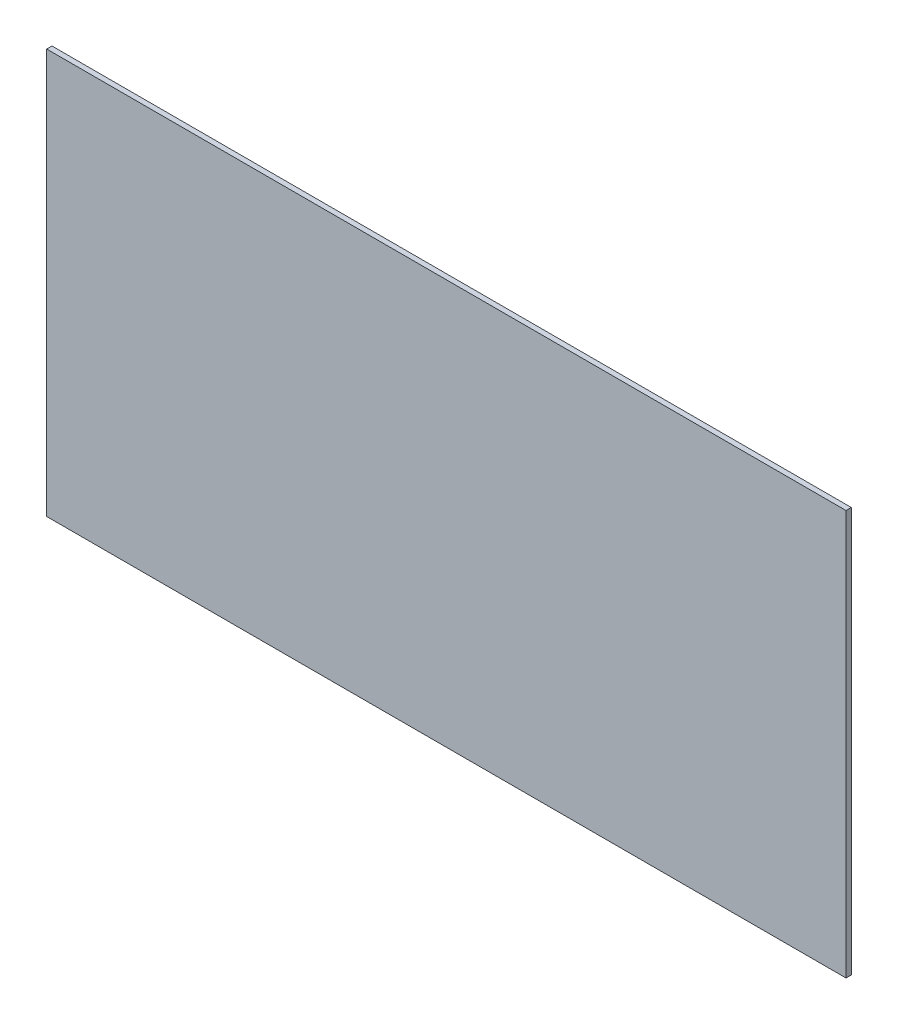
ISO-10303-21;
HEADER;
FILE_DESCRIPTION(('STEP AP214'),'2;1');
FILE_NAME('part.step','',(''),(''),'','','');
FILE_SCHEMA(('AUTOMOTIVE_DESIGN { 1 0 10303 214 1 1 1 1 }'));
ENDSEC;
DATA;
#1=APPLICATION_CONTEXT('core data for automotive mechanical design processes');
#2=APPLICATION_PROTOCOL_DEFINITION('international standard','automotive_design',2000,#1);
#3=PRODUCT_CONTEXT('',#1,'mechanical');
#4=PRODUCT('Part','Part','',(#3));
#5=PRODUCT_RELATED_PRODUCT_CATEGORY('part','',(#4));
#6=PRODUCT_DEFINITION_FORMATION('','',#4);
#7=PRODUCT_DEFINITION_CONTEXT('part definition',#1,'design');
#8=PRODUCT_DEFINITION('design','',#6,#7);
#9=PRODUCT_DEFINITION_SHAPE('','',#8);
#10=(LENGTH_UNIT() NAMED_UNIT(*) SI_UNIT(.MILLI.,.METRE.));
#11=(NAMED_UNIT(*) PLANE_ANGLE_UNIT() SI_UNIT($,.RADIAN.));
#12=(NAMED_UNIT(*) SI_UNIT($,.STERADIAN.) SOLID_ANGLE_UNIT());
#13=UNCERTAINTY_MEASURE_WITH_UNIT(LENGTH_MEASURE(1.E-05),#10,'distance_accuracy_value','');
#14=(GEOMETRIC_REPRESENTATION_CONTEXT(3) GLOBAL_UNCERTAINTY_ASSIGNED_CONTEXT((#13)) GLOBAL_UNIT_ASSIGNED_CONTEXT((#10,
#11,#12)) REPRESENTATION_CONTEXT('',''));
#15=CARTESIAN_POINT('',(0.,0.,0.));
#16=DIRECTION('',(0.,0.,1.));
#17=DIRECTION('',(1.,0.,0.));
#18=AXIS2_PLACEMENT_3D('',#15,#16,#17);
#19=CARTESIAN_POINT('',(0.,0.,10.));
#20=DIRECTION('',(1.,0.,0.));
#21=DIRECTION('',(0.,0.,-1.));
#22=AXIS2_PLACEMENT_3D('',#19,#20,#21);
#23=PLANE('',#22);
#24=DIRECTION('',(0.,-1.,0.));
#25=VECTOR('',#24,1.);
#26=CARTESIAN_POINT('',(0.,0.,0.));
#27=LINE('',#26,#25);
#28=CARTESIAN_POINT('',(0.,770.,0.));
#29=VERTEX_POINT('',#28);
#30=CARTESIAN_POINT('',(0.,0.,0.));
#31=VERTEX_POINT('',#30);
#32=EDGE_CURVE('E99',#29,#31,#27,.T.);
#33=ORIENTED_EDGE('',*,*,#32,.T.);
#34=DIRECTION('',(0.,0.,-1.));
#35=VECTOR('',#34,1.);
#36=CARTESIAN_POINT('',(0.,0.,10.));
#37=LINE('',#36,#35);
#38=CARTESIAN_POINT('',(0.,0.,10.));
#39=VERTEX_POINT('',#38);
#40=EDGE_CURVE('E11',#39,#31,#37,.T.);
#41=ORIENTED_EDGE('',*,*,#40,.F.);
#42=DIRECTION('',(0.,-1.,0.));
#43=VECTOR('',#42,1.);
#44=CARTESIAN_POINT('',(0.,0.,10.));
#45=LINE('',#44,#43);
#46=CARTESIAN_POINT('',(0.,770.,10.));
#47=VERTEX_POINT('',#46);
#48=EDGE_CURVE('E87',#47,#39,#45,.T.);
#49=ORIENTED_EDGE('',*,*,#48,.F.);
#50=DIRECTION('',(0.,0.,-1.));
#51=VECTOR('',#50,1.);
#52=CARTESIAN_POINT('',(0.,770.,10.));
#53=LINE('',#52,#51);
#54=EDGE_CURVE('E95',#47,#29,#53,.T.);
#55=ORIENTED_EDGE('',*,*,#54,.T.);
#56=EDGE_LOOP('',(#33,#41,#49,#55));
#57=FACE_BOUND('',#56,.T.);
#58=ADVANCED_FACE('F36',(#57),#23,.F.);
#59=CARTESIAN_POINT('',(0.,0.,10.));
#60=DIRECTION('',(0.,1.,0.));
#61=DIRECTION('',(0.,0.,1.));
#62=AXIS2_PLACEMENT_3D('',#59,#60,#61);
#63=PLANE('',#62);
#64=DIRECTION('',(1.,0.,0.));
#65=VECTOR('',#64,1.);
#66=CARTESIAN_POINT('',(0.,0.,0.));
#67=LINE('',#66,#65);
#68=CARTESIAN_POINT('',(1520.,0.,0.));
#69=VERTEX_POINT('',#68);
#70=EDGE_CURVE('E91',#31,#69,#67,.T.);
#71=ORIENTED_EDGE('',*,*,#70,.T.);
#72=DIRECTION('',(0.,0.,-1.));
#73=VECTOR('',#72,1.);
#74=CARTESIAN_POINT('',(1520.,0.,10.));
#75=LINE('',#74,#73);
#76=CARTESIAN_POINT('',(1520.,0.,10.));
#77=VERTEX_POINT('',#76);
#78=EDGE_CURVE('E44',#77,#69,#75,.T.);
#79=ORIENTED_EDGE('',*,*,#78,.F.);
#80=DIRECTION('',(1.,0.,0.));
#81=VECTOR('',#80,1.);
#82=CARTESIAN_POINT('',(0.,0.,10.));
#83=LINE('',#82,#81);
#84=EDGE_CURVE('E82',#39,#77,#83,.T.);
#85=ORIENTED_EDGE('',*,*,#84,.F.);
#86=ORIENTED_EDGE('',*,*,#40,.T.);
#87=EDGE_LOOP('',(#71,#79,#85,#86));
#88=FACE_BOUND('',#87,.T.);
#89=ADVANCED_FACE('F90',(#88),#63,.F.);
#90=CARTESIAN_POINT('',(1520.,0.,10.));
#91=DIRECTION('',(-1.,0.,0.));
#92=DIRECTION('',(0.,0.,1.));
#93=AXIS2_PLACEMENT_3D('',#90,#91,#92);
#94=PLANE('',#93);
#95=DIRECTION('',(0.,1.,0.));
#96=VECTOR('',#95,1.);
#97=CARTESIAN_POINT('',(1520.,0.,0.));
#98=LINE('',#97,#96);
#99=CARTESIAN_POINT('',(1520.,770.,0.));
#100=VERTEX_POINT('',#99);
#101=EDGE_CURVE('E69',#69,#100,#98,.T.);
#102=ORIENTED_EDGE('',*,*,#101,.T.);
#103=DIRECTION('',(0.,0.,-1.));
#104=VECTOR('',#103,1.);
#105=CARTESIAN_POINT('',(1520.,770.,10.));
#106=LINE('',#105,#104);
#107=CARTESIAN_POINT('',(1520.,770.,10.));
#108=VERTEX_POINT('',#107);
#109=EDGE_CURVE('E92',#108,#100,#106,.T.);
#110=ORIENTED_EDGE('',*,*,#109,.F.);
#111=DIRECTION('',(0.,1.,0.));
#112=VECTOR('',#111,1.);
#113=CARTESIAN_POINT('',(1520.,0.,10.));
#114=LINE('',#113,#112);
#115=EDGE_CURVE('E85',#77,#108,#114,.T.);
#116=ORIENTED_EDGE('',*,*,#115,.F.);
#117=ORIENTED_EDGE('',*,*,#78,.T.);
#118=EDGE_LOOP('',(#102,#110,#116,#117));
#119=FACE_BOUND('',#118,.T.);
#120=ADVANCED_FACE('F93',(#119),#94,.F.);
#121=CARTESIAN_POINT('',(0.,770.,10.));
#122=DIRECTION('',(0.,-1.,0.));
#123=DIRECTION('',(0.,0.,-1.));
#124=AXIS2_PLACEMENT_3D('',#121,#122,#123);
#125=PLANE('',#124);
#126=DIRECTION('',(-1.,0.,0.));
#127=VECTOR('',#126,1.);
#128=CARTESIAN_POINT('',(0.,770.,0.));
#129=LINE('',#128,#127);
#130=EDGE_CURVE('E75',#100,#29,#129,.T.);
#131=ORIENTED_EDGE('',*,*,#130,.T.);
#132=ORIENTED_EDGE('',*,*,#54,.F.);
#133=DIRECTION('',(-1.,0.,0.));
#134=VECTOR('',#133,1.);
#135=CARTESIAN_POINT('',(0.,770.,10.));
#136=LINE('',#135,#134);
#137=EDGE_CURVE('E52',#108,#47,#136,.T.);
#138=ORIENTED_EDGE('',*,*,#137,.F.);
#139=ORIENTED_EDGE('',*,*,#109,.T.);
#140=EDGE_LOOP('',(#131,#132,#138,#139));
#141=FACE_BOUND('',#140,.T.);
#142=ADVANCED_FACE('F106',(#141),#125,.F.);
#143=CARTESIAN_POINT('',(0.,0.,10.));
#144=DIRECTION('',(0.,0.,-1.));
#145=DIRECTION('',(-1.,0.,0.));
#146=AXIS2_PLACEMENT_3D('',#143,#144,#145);
#147=PLANE('',#146);
#148=ORIENTED_EDGE('',*,*,#48,.T.);
#149=ORIENTED_EDGE('',*,*,#84,.T.);
#150=ORIENTED_EDGE('',*,*,#115,.T.);
#151=ORIENTED_EDGE('',*,*,#137,.T.);
#152=EDGE_LOOP('',(#148,#149,#150,#151));
#153=FACE_BOUND('',#152,.T.);
#154=ADVANCED_FACE('F83',(#153),#147,.F.);
#155=CARTESIAN_POINT('',(0.,0.,0.));
#156=DIRECTION('',(0.,0.,-1.));
#157=DIRECTION('',(-1.,0.,0.));
#158=AXIS2_PLACEMENT_3D('',#155,#156,#157);
#159=PLANE('',#158);
#160=ORIENTED_EDGE('',*,*,#32,.F.);
#161=ORIENTED_EDGE('',*,*,#130,.F.);
#162=ORIENTED_EDGE('',*,*,#101,.F.);
#163=ORIENTED_EDGE('',*,*,#70,.F.);
#164=EDGE_LOOP('',(#160,#161,#162,#163));
#165=FACE_BOUND('',#164,.T.);
#166=ADVANCED_FACE('F109',(#165),#159,.T.);
#167=CLOSED_SHELL('',(#58,#89,#120,#142,#154,#166));
#168=MANIFOLD_SOLID_BREP('B2',#167);
#169=ADVANCED_BREP_SHAPE_REPRESENTATION('',(#18,#168),#14);
#170=SHAPE_DEFINITION_REPRESENTATION(#9,#169);
ENDSEC;
END-ISO-10303-21;
